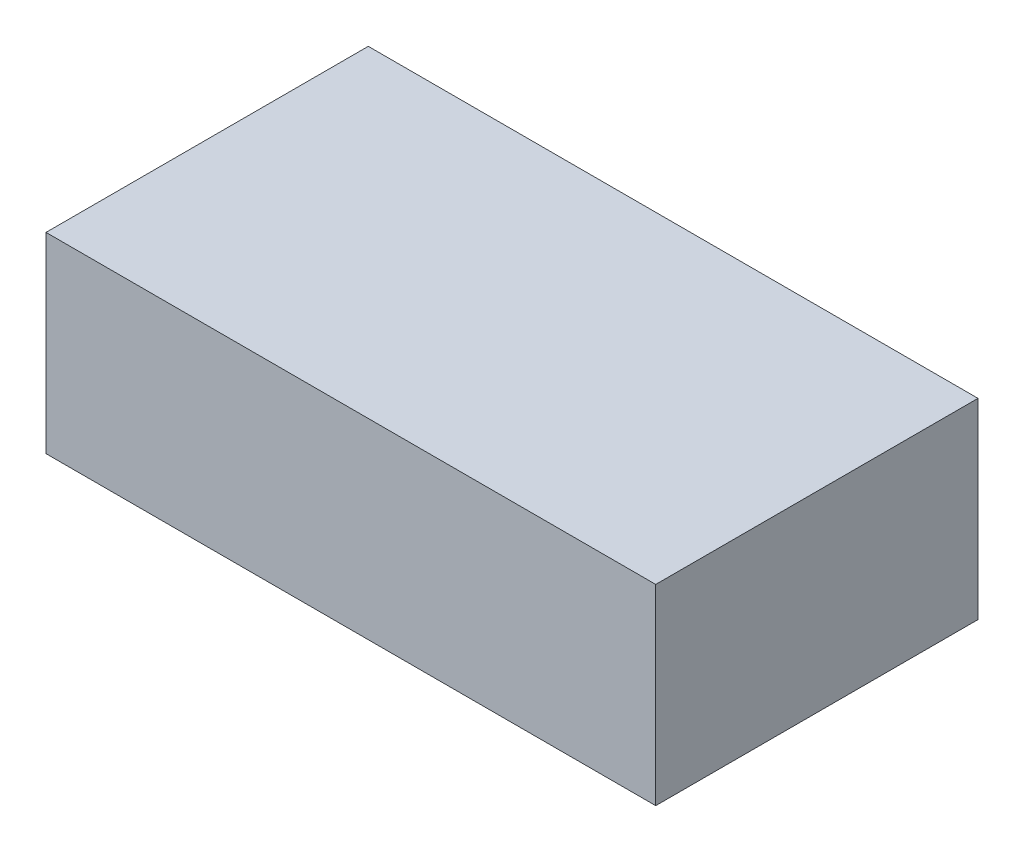
ISO-10303-21;
HEADER;
FILE_DESCRIPTION(('STEP AP214'),'2;1');
FILE_NAME('part.step','',(''),(''),'','','');
FILE_SCHEMA(('AUTOMOTIVE_DESIGN { 1 0 10303 214 1 1 1 1 }'));
ENDSEC;
DATA;
#1=APPLICATION_CONTEXT('core data for automotive mechanical design processes');
#2=APPLICATION_PROTOCOL_DEFINITION('international standard','automotive_design',2000,#1);
#3=PRODUCT_CONTEXT('',#1,'mechanical');
#4=PRODUCT('Part','Part','',(#3));
#5=PRODUCT_RELATED_PRODUCT_CATEGORY('part','',(#4));
#6=PRODUCT_DEFINITION_FORMATION('','',#4);
#7=PRODUCT_DEFINITION_CONTEXT('part definition',#1,'design');
#8=PRODUCT_DEFINITION('design','',#6,#7);
#9=PRODUCT_DEFINITION_SHAPE('','',#8);
#10=(LENGTH_UNIT() NAMED_UNIT(*) SI_UNIT(.MILLI.,.METRE.));
#11=(NAMED_UNIT(*) PLANE_ANGLE_UNIT() SI_UNIT($,.RADIAN.));
#12=(NAMED_UNIT(*) SI_UNIT($,.STERADIAN.) SOLID_ANGLE_UNIT());
#13=UNCERTAINTY_MEASURE_WITH_UNIT(LENGTH_MEASURE(1.E-05),#10,'distance_accuracy_value','');
#14=(GEOMETRIC_REPRESENTATION_CONTEXT(3) GLOBAL_UNCERTAINTY_ASSIGNED_CONTEXT((#13)) GLOBAL_UNIT_ASSIGNED_CONTEXT((#10,
#11,#12)) REPRESENTATION_CONTEXT('',''));
#15=CARTESIAN_POINT('',(0.,0.,0.));
#16=DIRECTION('',(0.,0.,1.));
#17=DIRECTION('',(1.,0.,0.));
#18=AXIS2_PLACEMENT_3D('',#15,#16,#17);
#19=CARTESIAN_POINT('',(35.,22.,-18.5));
#20=DIRECTION('',(-1.,0.,0.));
#21=DIRECTION('',(0.,0.,1.));
#22=AXIS2_PLACEMENT_3D('',#19,#20,#21);
#23=PLANE('',#22);
#24=DIRECTION('',(0.,0.,-1.));
#25=VECTOR('',#24,1.);
#26=CARTESIAN_POINT('',(35.,0.,-18.5));
#27=LINE('',#26,#25);
#28=CARTESIAN_POINT('',(35.,0.,18.5));
#29=VERTEX_POINT('',#28);
#30=CARTESIAN_POINT('',(35.,0.,-18.5));
#31=VERTEX_POINT('',#30);
#32=EDGE_CURVE('E117',#29,#31,#27,.T.);
#33=ORIENTED_EDGE('',*,*,#32,.T.);
#34=DIRECTION('',(0.,-1.,0.));
#35=VECTOR('',#34,1.);
#36=CARTESIAN_POINT('',(35.,22.,-18.5));
#37=LINE('',#36,#35);
#38=CARTESIAN_POINT('',(35.,22.,-18.5));
#39=VERTEX_POINT('',#38);
#40=EDGE_CURVE('E11',#39,#31,#37,.T.);
#41=ORIENTED_EDGE('',*,*,#40,.F.);
#42=DIRECTION('',(0.,0.,-1.));
#43=VECTOR('',#42,1.);
#44=CARTESIAN_POINT('',(35.,22.,-18.5));
#45=LINE('',#44,#43);
#46=CARTESIAN_POINT('',(35.,22.,18.5));
#47=VERTEX_POINT('',#46);
#48=EDGE_CURVE('E101',#47,#39,#45,.T.);
#49=ORIENTED_EDGE('',*,*,#48,.F.);
#50=DIRECTION('',(0.,-1.,0.));
#51=VECTOR('',#50,1.);
#52=CARTESIAN_POINT('',(35.,22.,18.5));
#53=LINE('',#52,#51);
#54=EDGE_CURVE('E113',#47,#29,#53,.T.);
#55=ORIENTED_EDGE('',*,*,#54,.T.);
#56=EDGE_LOOP('',(#33,#41,#49,#55));
#57=FACE_BOUND('',#56,.T.);
#58=ADVANCED_FACE('F49',(#57),#23,.F.);
#59=CARTESIAN_POINT('',(-35.,22.,-18.5));
#60=DIRECTION('',(0.,0.,1.));
#61=DIRECTION('',(1.,0.,0.));
#62=AXIS2_PLACEMENT_3D('',#59,#60,#61);
#63=PLANE('',#62);
#64=DIRECTION('',(-1.,0.,0.));
#65=VECTOR('',#64,1.);
#66=CARTESIAN_POINT('',(-35.,0.,-18.5));
#67=LINE('',#66,#65);
#68=CARTESIAN_POINT('',(-35.,0.,-18.5));
#69=VERTEX_POINT('',#68);
#70=EDGE_CURVE('E106',#31,#69,#67,.T.);
#71=ORIENTED_EDGE('',*,*,#70,.T.);
#72=DIRECTION('',(0.,-1.,0.));
#73=VECTOR('',#72,1.);
#74=CARTESIAN_POINT('',(-35.,22.,-18.5));
#75=LINE('',#74,#73);
#76=CARTESIAN_POINT('',(-35.,22.,-18.5));
#77=VERTEX_POINT('',#76);
#78=EDGE_CURVE('E58',#77,#69,#75,.T.);
#79=ORIENTED_EDGE('',*,*,#78,.F.);
#80=DIRECTION('',(-1.,0.,0.));
#81=VECTOR('',#80,1.);
#82=CARTESIAN_POINT('',(-35.,22.,-18.5));
#83=LINE('',#82,#81);
#84=EDGE_CURVE('E96',#39,#77,#83,.T.);
#85=ORIENTED_EDGE('',*,*,#84,.F.);
#86=ORIENTED_EDGE('',*,*,#40,.T.);
#87=EDGE_LOOP('',(#71,#79,#85,#86));
#88=FACE_BOUND('',#87,.T.);
#89=ADVANCED_FACE('F105',(#88),#63,.F.);
#90=CARTESIAN_POINT('',(-35.,22.,-18.5));
#91=DIRECTION('',(1.,0.,0.));
#92=DIRECTION('',(0.,0.,-1.));
#93=AXIS2_PLACEMENT_3D('',#90,#91,#92);
#94=PLANE('',#93);
#95=DIRECTION('',(0.,0.,1.));
#96=VECTOR('',#95,1.);
#97=CARTESIAN_POINT('',(-35.,0.,-18.5));
#98=LINE('',#97,#96);
#99=CARTESIAN_POINT('',(-35.,0.,18.5));
#100=VERTEX_POINT('',#99);
#101=EDGE_CURVE('E83',#69,#100,#98,.T.);
#102=ORIENTED_EDGE('',*,*,#101,.T.);
#103=DIRECTION('',(0.,-1.,0.));
#104=VECTOR('',#103,1.);
#105=CARTESIAN_POINT('',(-35.,22.,18.5));
#106=LINE('',#105,#104);
#107=CARTESIAN_POINT('',(-35.,22.,18.5));
#108=VERTEX_POINT('',#107);
#109=EDGE_CURVE('E108',#108,#100,#106,.T.);
#110=ORIENTED_EDGE('',*,*,#109,.F.);
#111=DIRECTION('',(0.,0.,1.));
#112=VECTOR('',#111,1.);
#113=CARTESIAN_POINT('',(-35.,22.,-18.5));
#114=LINE('',#113,#112);
#115=EDGE_CURVE('E99',#77,#108,#114,.T.);
#116=ORIENTED_EDGE('',*,*,#115,.F.);
#117=ORIENTED_EDGE('',*,*,#78,.T.);
#118=EDGE_LOOP('',(#102,#110,#116,#117));
#119=FACE_BOUND('',#118,.T.);
#120=ADVANCED_FACE('F109',(#119),#94,.F.);
#121=CARTESIAN_POINT('',(-35.,22.,18.5));
#122=DIRECTION('',(0.,0.,-1.));
#123=DIRECTION('',(-1.,0.,0.));
#124=AXIS2_PLACEMENT_3D('',#121,#122,#123);
#125=PLANE('',#124);
#126=DIRECTION('',(1.,0.,0.));
#127=VECTOR('',#126,1.);
#128=CARTESIAN_POINT('',(-35.,0.,18.5));
#129=LINE('',#128,#127);
#130=EDGE_CURVE('E89',#100,#29,#129,.T.);
#131=ORIENTED_EDGE('',*,*,#130,.T.);
#132=ORIENTED_EDGE('',*,*,#54,.F.);
#133=DIRECTION('',(1.,0.,0.));
#134=VECTOR('',#133,1.);
#135=CARTESIAN_POINT('',(-35.,22.,18.5));
#136=LINE('',#135,#134);
#137=EDGE_CURVE('E66',#108,#47,#136,.T.);
#138=ORIENTED_EDGE('',*,*,#137,.F.);
#139=ORIENTED_EDGE('',*,*,#109,.T.);
#140=EDGE_LOOP('',(#131,#132,#138,#139));
#141=FACE_BOUND('',#140,.T.);
#142=ADVANCED_FACE('F130',(#141),#125,.F.);
#143=CARTESIAN_POINT('',(0.,22.,0.));
#144=DIRECTION('',(0.,1.,0.));
#145=DIRECTION('',(0.,0.,1.));
#146=AXIS2_PLACEMENT_3D('',#143,#144,#145);
#147=PLANE('',#146);
#148=ORIENTED_EDGE('',*,*,#48,.T.);
#149=ORIENTED_EDGE('',*,*,#84,.T.);
#150=ORIENTED_EDGE('',*,*,#115,.T.);
#151=ORIENTED_EDGE('',*,*,#137,.T.);
#152=EDGE_LOOP('',(#148,#149,#150,#151));
#153=FACE_BOUND('',#152,.T.);
#154=ADVANCED_FACE('F97',(#153),#147,.T.);
#155=CARTESIAN_POINT('',(0.,0.,0.));
#156=DIRECTION('',(0.,1.,0.));
#157=DIRECTION('',(0.,0.,1.));
#158=AXIS2_PLACEMENT_3D('',#155,#156,#157);
#159=PLANE('',#158);
#160=ORIENTED_EDGE('',*,*,#32,.F.);
#161=ORIENTED_EDGE('',*,*,#130,.F.);
#162=ORIENTED_EDGE('',*,*,#101,.F.);
#163=ORIENTED_EDGE('',*,*,#70,.F.);
#164=EDGE_LOOP('',(#160,#161,#162,#163));
#165=FACE_BOUND('',#164,.T.);
#166=ADVANCED_FACE('F133',(#165),#159,.F.);
#167=CLOSED_SHELL('',(#58,#89,#120,#142,#154,#166));
#168=MANIFOLD_SOLID_BREP('B2',#167);
#169=ADVANCED_BREP_SHAPE_REPRESENTATION('',(#18,#168),#14);
#170=SHAPE_DEFINITION_REPRESENTATION(#9,#169);
ENDSEC;
END-ISO-10303-21;
